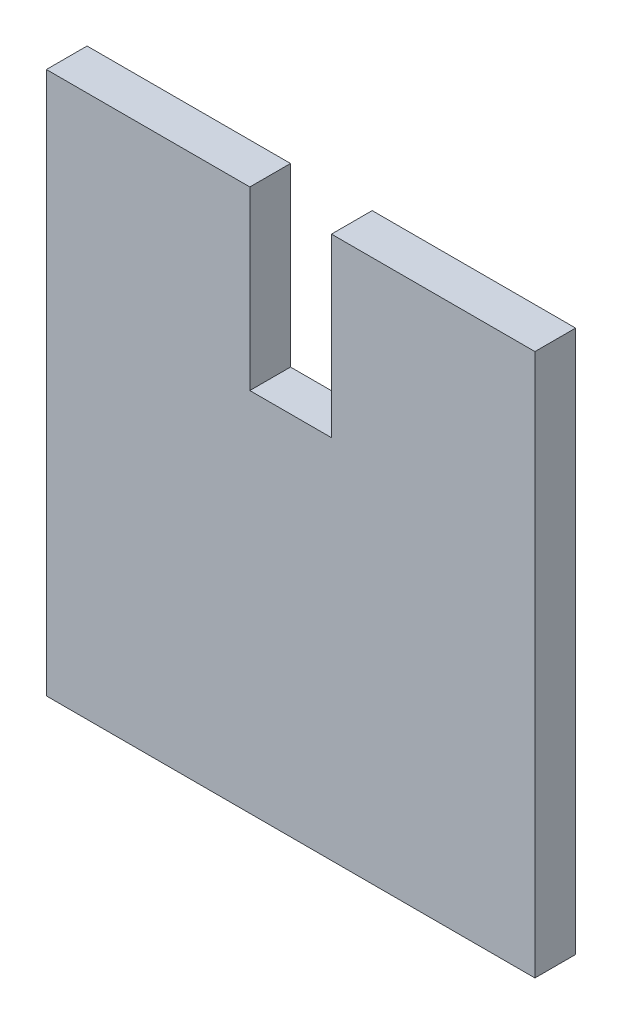
ISO-10303-21;
HEADER;
FILE_DESCRIPTION(('STEP AP214'),'2;1');
FILE_NAME('part.step','',(''),(''),'','','');
FILE_SCHEMA(('AUTOMOTIVE_DESIGN { 1 0 10303 214 1 1 1 1 }'));
ENDSEC;
DATA;
#1=APPLICATION_CONTEXT('core data for automotive mechanical design processes');
#2=APPLICATION_PROTOCOL_DEFINITION('international standard','automotive_design',2000,#1);
#3=PRODUCT_CONTEXT('',#1,'mechanical');
#4=PRODUCT('Part','Part','',(#3));
#5=PRODUCT_RELATED_PRODUCT_CATEGORY('part','',(#4));
#6=PRODUCT_DEFINITION_FORMATION('','',#4);
#7=PRODUCT_DEFINITION_CONTEXT('part definition',#1,'design');
#8=PRODUCT_DEFINITION('design','',#6,#7);
#9=PRODUCT_DEFINITION_SHAPE('','',#8);
#10=(LENGTH_UNIT() NAMED_UNIT(*) SI_UNIT(.MILLI.,.METRE.));
#11=(NAMED_UNIT(*) PLANE_ANGLE_UNIT() SI_UNIT($,.RADIAN.));
#12=(NAMED_UNIT(*) SI_UNIT($,.STERADIAN.) SOLID_ANGLE_UNIT());
#13=UNCERTAINTY_MEASURE_WITH_UNIT(LENGTH_MEASURE(1.E-05),#10,'distance_accuracy_value','');
#14=(GEOMETRIC_REPRESENTATION_CONTEXT(3) GLOBAL_UNCERTAINTY_ASSIGNED_CONTEXT((#13)) GLOBAL_UNIT_ASSIGNED_CONTEXT((#10,
#11,#12)) REPRESENTATION_CONTEXT('',''));
#15=CARTESIAN_POINT('',(0.,0.,0.));
#16=DIRECTION('',(0.,0.,1.));
#17=DIRECTION('',(1.,0.,0.));
#18=AXIS2_PLACEMENT_3D('',#15,#16,#17);
#19=CARTESIAN_POINT('',(72.04,0.,6.));
#20=DIRECTION('',(0.,1.,0.));
#21=DIRECTION('',(-1.,0.,0.));
#22=AXIS2_PLACEMENT_3D('',#19,#20,#21);
#23=PLANE('',#22);
#24=DIRECTION('',(1.,0.,0.));
#25=VECTOR('',#24,1.);
#26=CARTESIAN_POINT('',(72.04,0.,0.));
#27=LINE('',#26,#25);
#28=CARTESIAN_POINT('',(0.,0.,0.));
#29=VERTEX_POINT('',#28);
#30=CARTESIAN_POINT('',(72.04,0.,0.));
#31=VERTEX_POINT('',#30);
#32=EDGE_CURVE('E134',#29,#31,#27,.T.);
#33=ORIENTED_EDGE('',*,*,#32,.T.);
#34=DIRECTION('',(0.,0.,-1.));
#35=VECTOR('',#34,1.);
#36=CARTESIAN_POINT('',(72.04,0.,6.));
#37=LINE('',#36,#35);
#38=CARTESIAN_POINT('',(72.04,0.,6.));
#39=VERTEX_POINT('',#38);
#40=EDGE_CURVE('E11',#39,#31,#37,.T.);
#41=ORIENTED_EDGE('',*,*,#40,.F.);
#42=DIRECTION('',(1.,0.,0.));
#43=VECTOR('',#42,1.);
#44=CARTESIAN_POINT('',(72.04,0.,6.));
#45=LINE('',#44,#43);
#46=CARTESIAN_POINT('',(0.,0.,6.));
#47=VERTEX_POINT('',#46);
#48=EDGE_CURVE('E148',#47,#39,#45,.T.);
#49=ORIENTED_EDGE('',*,*,#48,.F.);
#50=DIRECTION('',(0.,0.,-1.));
#51=VECTOR('',#50,1.);
#52=CARTESIAN_POINT('',(0.,0.,6.));
#53=LINE('',#52,#51);
#54=EDGE_CURVE('E130',#47,#29,#53,.T.);
#55=ORIENTED_EDGE('',*,*,#54,.T.);
#56=EDGE_LOOP('',(#33,#41,#49,#55));
#57=FACE_BOUND('',#56,.T.);
#58=ADVANCED_FACE('F38',(#57),#23,.F.);
#59=CARTESIAN_POINT('',(72.04,80.,6.));
#60=DIRECTION('',(-1.,0.,0.));
#61=DIRECTION('',(0.,-1.,0.));
#62=AXIS2_PLACEMENT_3D('',#59,#60,#61);
#63=PLANE('',#62);
#64=DIRECTION('',(0.,1.,0.));
#65=VECTOR('',#64,1.);
#66=CARTESIAN_POINT('',(72.04,80.,0.));
#67=LINE('',#66,#65);
#68=CARTESIAN_POINT('',(72.04,80.,0.));
#69=VERTEX_POINT('',#68);
#70=EDGE_CURVE('E137',#31,#69,#67,.T.);
#71=ORIENTED_EDGE('',*,*,#70,.T.);
#72=DIRECTION('',(0.,0.,-1.));
#73=VECTOR('',#72,1.);
#74=CARTESIAN_POINT('',(72.04,80.,6.));
#75=LINE('',#74,#73);
#76=CARTESIAN_POINT('',(72.04,80.,6.));
#77=VERTEX_POINT('',#76);
#78=EDGE_CURVE('E46',#77,#69,#75,.T.);
#79=ORIENTED_EDGE('',*,*,#78,.F.);
#80=DIRECTION('',(0.,1.,0.));
#81=VECTOR('',#80,1.);
#82=CARTESIAN_POINT('',(72.04,80.,6.));
#83=LINE('',#82,#81);
#84=EDGE_CURVE('E97',#39,#77,#83,.T.);
#85=ORIENTED_EDGE('',*,*,#84,.F.);
#86=ORIENTED_EDGE('',*,*,#40,.T.);
#87=EDGE_LOOP('',(#71,#79,#85,#86));
#88=FACE_BOUND('',#87,.T.);
#89=ADVANCED_FACE('F183',(#88),#63,.F.);
#90=CARTESIAN_POINT('',(42.04,80.,6.));
#91=DIRECTION('',(0.,-1.,0.));
#92=DIRECTION('',(0.,0.,-1.));
#93=AXIS2_PLACEMENT_3D('',#90,#91,#92);
#94=PLANE('',#93);
#95=DIRECTION('',(-1.,0.,0.));
#96=VECTOR('',#95,1.);
#97=CARTESIAN_POINT('',(42.04,80.,0.));
#98=LINE('',#97,#96);
#99=CARTESIAN_POINT('',(42.04,80.,0.));
#100=VERTEX_POINT('',#99);
#101=EDGE_CURVE('E139',#69,#100,#98,.T.);
#102=ORIENTED_EDGE('',*,*,#101,.T.);
#103=DIRECTION('',(0.,0.,-1.));
#104=VECTOR('',#103,1.);
#105=CARTESIAN_POINT('',(42.04,80.,6.));
#106=LINE('',#105,#104);
#107=CARTESIAN_POINT('',(42.04,80.,6.));
#108=VERTEX_POINT('',#107);
#109=EDGE_CURVE('E155',#108,#100,#106,.T.);
#110=ORIENTED_EDGE('',*,*,#109,.F.);
#111=DIRECTION('',(-1.,0.,0.));
#112=VECTOR('',#111,1.);
#113=CARTESIAN_POINT('',(42.04,80.,6.));
#114=LINE('',#113,#112);
#115=EDGE_CURVE('E163',#77,#108,#114,.T.);
#116=ORIENTED_EDGE('',*,*,#115,.F.);
#117=ORIENTED_EDGE('',*,*,#78,.T.);
#118=EDGE_LOOP('',(#102,#110,#116,#117));
#119=FACE_BOUND('',#118,.T.);
#120=ADVANCED_FACE('F161',(#119),#94,.F.);
#121=CARTESIAN_POINT('',(42.04,54.,6.));
#122=DIRECTION('',(1.,0.,0.));
#123=DIRECTION('',(0.,0.,-1.));
#124=AXIS2_PLACEMENT_3D('',#121,#122,#123);
#125=PLANE('',#124);
#126=DIRECTION('',(0.,-1.,0.));
#127=VECTOR('',#126,1.);
#128=CARTESIAN_POINT('',(42.04,54.,0.));
#129=LINE('',#128,#127);
#130=CARTESIAN_POINT('',(42.04,54.,0.));
#131=VERTEX_POINT('',#130);
#132=EDGE_CURVE('E141',#100,#131,#129,.T.);
#133=ORIENTED_EDGE('',*,*,#132,.T.);
#134=DIRECTION('',(0.,0.,-1.));
#135=VECTOR('',#134,1.);
#136=CARTESIAN_POINT('',(42.04,54.,6.));
#137=LINE('',#136,#135);
#138=CARTESIAN_POINT('',(42.04,54.,6.));
#139=VERTEX_POINT('',#138);
#140=EDGE_CURVE('E152',#139,#131,#137,.T.);
#141=ORIENTED_EDGE('',*,*,#140,.F.);
#142=DIRECTION('',(0.,-1.,0.));
#143=VECTOR('',#142,1.);
#144=CARTESIAN_POINT('',(42.04,54.,6.));
#145=LINE('',#144,#143);
#146=EDGE_CURVE('E175',#108,#139,#145,.T.);
#147=ORIENTED_EDGE('',*,*,#146,.F.);
#148=ORIENTED_EDGE('',*,*,#109,.T.);
#149=EDGE_LOOP('',(#133,#141,#147,#148));
#150=FACE_BOUND('',#149,.T.);
#151=ADVANCED_FACE('F171',(#150),#125,.F.);
#152=CARTESIAN_POINT('',(30.,54.,6.));
#153=DIRECTION('',(0.,-1.,0.));
#154=DIRECTION('',(0.,0.,-1.));
#155=AXIS2_PLACEMENT_3D('',#152,#153,#154);
#156=PLANE('',#155);
#157=DIRECTION('',(-1.,0.,0.));
#158=VECTOR('',#157,1.);
#159=CARTESIAN_POINT('',(30.,54.,0.));
#160=LINE('',#159,#158);
#161=CARTESIAN_POINT('',(30.,54.,0.));
#162=VERTEX_POINT('',#161);
#163=EDGE_CURVE('E143',#131,#162,#160,.T.);
#164=ORIENTED_EDGE('',*,*,#163,.T.);
#165=DIRECTION('',(0.,0.,-1.));
#166=VECTOR('',#165,1.);
#167=CARTESIAN_POINT('',(30.,54.,6.));
#168=LINE('',#167,#166);
#169=CARTESIAN_POINT('',(30.,54.,6.));
#170=VERTEX_POINT('',#169);
#171=EDGE_CURVE('E125',#170,#162,#168,.T.);
#172=ORIENTED_EDGE('',*,*,#171,.F.);
#173=DIRECTION('',(-1.,0.,0.));
#174=VECTOR('',#173,1.);
#175=CARTESIAN_POINT('',(30.,54.,6.));
#176=LINE('',#175,#174);
#177=EDGE_CURVE('E116',#139,#170,#176,.T.);
#178=ORIENTED_EDGE('',*,*,#177,.F.);
#179=ORIENTED_EDGE('',*,*,#140,.T.);
#180=EDGE_LOOP('',(#164,#172,#178,#179));
#181=FACE_BOUND('',#180,.T.);
#182=ADVANCED_FACE('F174',(#181),#156,.F.);
#183=CARTESIAN_POINT('',(30.,80.,6.));
#184=DIRECTION('',(-1.,0.,0.));
#185=DIRECTION('',(0.,-1.,0.));
#186=AXIS2_PLACEMENT_3D('',#183,#184,#185);
#187=PLANE('',#186);
#188=DIRECTION('',(0.,1.,0.));
#189=VECTOR('',#188,1.);
#190=CARTESIAN_POINT('',(30.,80.,0.));
#191=LINE('',#190,#189);
#192=CARTESIAN_POINT('',(30.,80.,0.));
#193=VERTEX_POINT('',#192);
#194=EDGE_CURVE('E124',#162,#193,#191,.T.);
#195=ORIENTED_EDGE('',*,*,#194,.T.);
#196=DIRECTION('',(0.,0.,-1.));
#197=VECTOR('',#196,1.);
#198=CARTESIAN_POINT('',(30.,80.,6.));
#199=LINE('',#198,#197);
#200=CARTESIAN_POINT('',(30.,80.,6.));
#201=VERTEX_POINT('',#200);
#202=EDGE_CURVE('E121',#201,#193,#199,.T.);
#203=ORIENTED_EDGE('',*,*,#202,.F.);
#204=DIRECTION('',(0.,1.,0.));
#205=VECTOR('',#204,1.);
#206=CARTESIAN_POINT('',(30.,80.,6.));
#207=LINE('',#206,#205);
#208=EDGE_CURVE('E110',#170,#201,#207,.T.);
#209=ORIENTED_EDGE('',*,*,#208,.F.);
#210=ORIENTED_EDGE('',*,*,#171,.T.);
#211=EDGE_LOOP('',(#195,#203,#209,#210));
#212=FACE_BOUND('',#211,.T.);
#213=ADVANCED_FACE('F122',(#212),#187,.F.);
#214=CARTESIAN_POINT('',(0.,80.,6.));
#215=DIRECTION('',(0.,-1.,0.));
#216=DIRECTION('',(0.,0.,-1.));
#217=AXIS2_PLACEMENT_3D('',#214,#215,#216);
#218=PLANE('',#217);
#219=DIRECTION('',(-1.,0.,0.));
#220=VECTOR('',#219,1.);
#221=CARTESIAN_POINT('',(0.,80.,0.));
#222=LINE('',#221,#220);
#223=CARTESIAN_POINT('',(0.,80.,0.));
#224=VERTEX_POINT('',#223);
#225=EDGE_CURVE('E83',#193,#224,#222,.T.);
#226=ORIENTED_EDGE('',*,*,#225,.T.);
#227=DIRECTION('',(0.,0.,-1.));
#228=VECTOR('',#227,1.);
#229=CARTESIAN_POINT('',(0.,80.,6.));
#230=LINE('',#229,#228);
#231=CARTESIAN_POINT('',(0.,80.,6.));
#232=VERTEX_POINT('',#231);
#233=EDGE_CURVE('E126',#232,#224,#230,.T.);
#234=ORIENTED_EDGE('',*,*,#233,.F.);
#235=DIRECTION('',(-1.,0.,0.));
#236=VECTOR('',#235,1.);
#237=CARTESIAN_POINT('',(0.,80.,6.));
#238=LINE('',#237,#236);
#239=EDGE_CURVE('E114',#201,#232,#238,.T.);
#240=ORIENTED_EDGE('',*,*,#239,.F.);
#241=ORIENTED_EDGE('',*,*,#202,.T.);
#242=EDGE_LOOP('',(#226,#234,#240,#241));
#243=FACE_BOUND('',#242,.T.);
#244=ADVANCED_FACE('F128',(#243),#218,.F.);
#245=CARTESIAN_POINT('',(0.,0.,6.));
#246=DIRECTION('',(1.,0.,0.));
#247=DIRECTION('',(0.,0.,-1.));
#248=AXIS2_PLACEMENT_3D('',#245,#246,#247);
#249=PLANE('',#248);
#250=DIRECTION('',(0.,-1.,0.));
#251=VECTOR('',#250,1.);
#252=CARTESIAN_POINT('',(0.,0.,0.));
#253=LINE('',#252,#251);
#254=EDGE_CURVE('E89',#224,#29,#253,.T.);
#255=ORIENTED_EDGE('',*,*,#254,.T.);
#256=ORIENTED_EDGE('',*,*,#54,.F.);
#257=DIRECTION('',(0.,-1.,0.));
#258=VECTOR('',#257,1.);
#259=CARTESIAN_POINT('',(0.,0.,6.));
#260=LINE('',#259,#258);
#261=EDGE_CURVE('E54',#232,#47,#260,.T.);
#262=ORIENTED_EDGE('',*,*,#261,.F.);
#263=ORIENTED_EDGE('',*,*,#233,.T.);
#264=EDGE_LOOP('',(#255,#256,#262,#263));
#265=FACE_BOUND('',#264,.T.);
#266=ADVANCED_FACE('F199',(#265),#249,.F.);
#267=CARTESIAN_POINT('',(0.,0.,6.));
#268=DIRECTION('',(0.,0.,-1.));
#269=DIRECTION('',(-1.,0.,0.));
#270=AXIS2_PLACEMENT_3D('',#267,#268,#269);
#271=PLANE('',#270);
#272=ORIENTED_EDGE('',*,*,#48,.T.);
#273=ORIENTED_EDGE('',*,*,#84,.T.);
#274=ORIENTED_EDGE('',*,*,#115,.T.);
#275=ORIENTED_EDGE('',*,*,#146,.T.);
#276=ORIENTED_EDGE('',*,*,#177,.T.);
#277=ORIENTED_EDGE('',*,*,#208,.T.);
#278=ORIENTED_EDGE('',*,*,#239,.T.);
#279=ORIENTED_EDGE('',*,*,#261,.T.);
#280=EDGE_LOOP('',(#272,#273,#274,#275,#276,#277,#278,#279));
#281=FACE_BOUND('',#280,.T.);
#282=ADVANCED_FACE('F112',(#281),#271,.F.);
#283=CARTESIAN_POINT('',(0.,0.,0.));
#284=DIRECTION('',(0.,0.,-1.));
#285=DIRECTION('',(-1.,0.,0.));
#286=AXIS2_PLACEMENT_3D('',#283,#284,#285);
#287=PLANE('',#286);
#288=ORIENTED_EDGE('',*,*,#32,.F.);
#289=ORIENTED_EDGE('',*,*,#254,.F.);
#290=ORIENTED_EDGE('',*,*,#225,.F.);
#291=ORIENTED_EDGE('',*,*,#194,.F.);
#292=ORIENTED_EDGE('',*,*,#163,.F.);
#293=ORIENTED_EDGE('',*,*,#132,.F.);
#294=ORIENTED_EDGE('',*,*,#101,.F.);
#295=ORIENTED_EDGE('',*,*,#70,.F.);
#296=EDGE_LOOP('',(#288,#289,#290,#291,#292,#293,#294,#295));
#297=FACE_BOUND('',#296,.T.);
#298=ADVANCED_FACE('F167',(#297),#287,.T.);
#299=CLOSED_SHELL('',(#58,#89,#120,#151,#182,#213,#244,#266,#282,#298));
#300=MANIFOLD_SOLID_BREP('B2',#299);
#301=ADVANCED_BREP_SHAPE_REPRESENTATION('',(#18,#300),#14);
#302=SHAPE_DEFINITION_REPRESENTATION(#9,#301);
ENDSEC;
END-ISO-10303-21;
